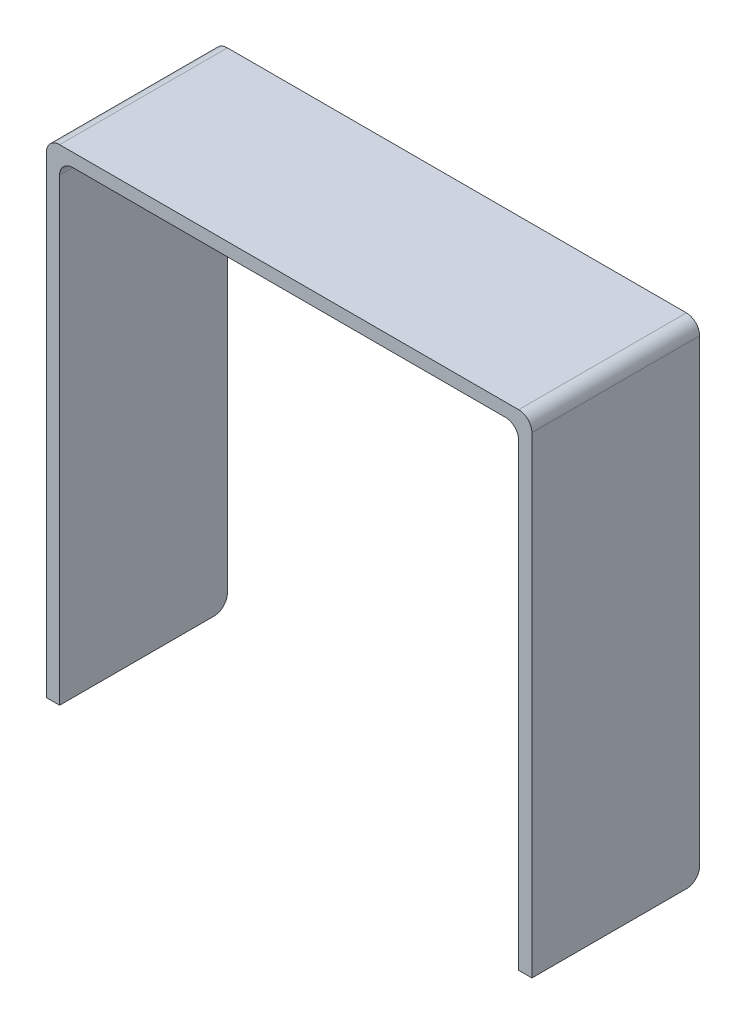
ISO-10303-21;
HEADER;
FILE_DESCRIPTION(('STEP AP214'),'2;1');
FILE_NAME('part.step','',(''),(''),'','','');
FILE_SCHEMA(('AUTOMOTIVE_DESIGN { 1 0 10303 214 1 1 1 1 }'));
ENDSEC;
DATA;
#1=APPLICATION_CONTEXT('core data for automotive mechanical design processes');
#2=APPLICATION_PROTOCOL_DEFINITION('international standard','automotive_design',2000,#1);
#3=PRODUCT_CONTEXT('',#1,'mechanical');
#4=PRODUCT('Part','Part','',(#3));
#5=PRODUCT_RELATED_PRODUCT_CATEGORY('part','',(#4));
#6=PRODUCT_DEFINITION_FORMATION('','',#4);
#7=PRODUCT_DEFINITION_CONTEXT('part definition',#1,'design');
#8=PRODUCT_DEFINITION('design','',#6,#7);
#9=PRODUCT_DEFINITION_SHAPE('','',#8);
#10=(LENGTH_UNIT() NAMED_UNIT(*) SI_UNIT(.MILLI.,.METRE.));
#11=(NAMED_UNIT(*) PLANE_ANGLE_UNIT() SI_UNIT($,.RADIAN.));
#12=(NAMED_UNIT(*) SI_UNIT($,.STERADIAN.) SOLID_ANGLE_UNIT());
#13=UNCERTAINTY_MEASURE_WITH_UNIT(LENGTH_MEASURE(1.E-05),#10,'distance_accuracy_value','');
#14=(GEOMETRIC_REPRESENTATION_CONTEXT(3) GLOBAL_UNCERTAINTY_ASSIGNED_CONTEXT((#13)) GLOBAL_UNIT_ASSIGNED_CONTEXT((#10,
#11,#12)) REPRESENTATION_CONTEXT('',''));
#15=CARTESIAN_POINT('',(0.,0.,0.));
#16=DIRECTION('',(0.,0.,1.));
#17=DIRECTION('',(1.,0.,0.));
#18=AXIS2_PLACEMENT_3D('',#15,#16,#17);
#19=CARTESIAN_POINT('',(0.,0.,0.));
#20=DIRECTION('',(0.,-1.,0.));
#21=DIRECTION('',(0.,0.,-1.));
#22=AXIS2_PLACEMENT_3D('',#19,#20,#21);
#23=PLANE('',#22);
#24=DIRECTION('',(-1.,0.,0.));
#25=VECTOR('',#24,1.);
#26=CARTESIAN_POINT('',(55.,0.,19.));
#27=LINE('',#26,#25);
#28=CARTESIAN_POINT('',(49.,0.,19.));
#29=VERTEX_POINT('',#28);
#30=CARTESIAN_POINT('',(-49.,0.,19.));
#31=VERTEX_POINT('',#30);
#32=EDGE_CURVE('E248',#29,#31,#27,.T.);
#33=ORIENTED_EDGE('',*,*,#32,.T.);
#34=DIRECTION('',(0.,0.,1.));
#35=VECTOR('',#34,1.);
#36=CARTESIAN_POINT('',(-49.,0.,0.));
#37=LINE('',#36,#35);
#38=CARTESIAN_POINT('',(-49.,0.,-19.));
#39=VERTEX_POINT('',#38);
#40=EDGE_CURVE('E308',#31,#39,#37,.F.);
#41=ORIENTED_EDGE('',*,*,#40,.T.);
#42=DIRECTION('',(-1.,0.,0.));
#43=VECTOR('',#42,1.);
#44=CARTESIAN_POINT('',(55.,0.,-19.));
#45=LINE('',#44,#43);
#46=CARTESIAN_POINT('',(49.,0.,-19.));
#47=VERTEX_POINT('',#46);
#48=EDGE_CURVE('E243',#47,#39,#45,.T.);
#49=ORIENTED_EDGE('',*,*,#48,.F.);
#50=DIRECTION('',(0.,0.,-1.));
#51=VECTOR('',#50,1.);
#52=CARTESIAN_POINT('',(49.,0.,0.));
#53=LINE('',#52,#51);
#54=EDGE_CURVE('E297',#47,#29,#53,.F.);
#55=ORIENTED_EDGE('',*,*,#54,.T.);
#56=EDGE_LOOP('',(#33,#41,#49,#55));
#57=FACE_BOUND('',#56,.T.);
#58=ADVANCED_FACE('F86',(#57),#23,.T.);
#59=CARTESIAN_POINT('',(55.,3.,19.));
#60=DIRECTION('',(0.,0.,1.));
#61=DIRECTION('',(1.,0.,0.));
#62=AXIS2_PLACEMENT_3D('',#59,#60,#61);
#63=PLANE('',#62);
#64=DIRECTION('',(-1.,0.,0.));
#65=VECTOR('',#64,1.);
#66=CARTESIAN_POINT('',(55.,3.,19.));
#67=LINE('',#66,#65);
#68=CARTESIAN_POINT('',(52.,3.,19.));
#69=VERTEX_POINT('',#68);
#70=CARTESIAN_POINT('',(-52.,3.,19.));
#71=VERTEX_POINT('',#70);
#72=EDGE_CURVE('E239',#69,#71,#67,.T.);
#73=ORIENTED_EDGE('',*,*,#72,.T.);
#74=CARTESIAN_POINT('',(-52.,0.,19.));
#75=DIRECTION('',(0.,0.,1.));
#76=DIRECTION('',(1.,0.,0.));
#77=AXIS2_PLACEMENT_3D('',#74,#75,#76);
#78=CIRCLE('',#77,3.);
#79=CARTESIAN_POINT('',(-55.,0.,19.));
#80=VERTEX_POINT('',#79);
#81=EDGE_CURVE('E277',#71,#80,#78,.T.);
#82=ORIENTED_EDGE('',*,*,#81,.T.);
#83=DIRECTION('',(0.,-1.,0.));
#84=VECTOR('',#83,1.);
#85=CARTESIAN_POINT('',(-55.,3.,19.));
#86=LINE('',#85,#84);
#87=CARTESIAN_POINT('',(-55.,-107.,19.));
#88=VERTEX_POINT('',#87);
#89=EDGE_CURVE('E215',#80,#88,#86,.T.);
#90=ORIENTED_EDGE('',*,*,#89,.T.);
#91=DIRECTION('',(-1.,0.,0.));
#92=VECTOR('',#91,1.);
#93=CARTESIAN_POINT('',(-55.,-107.,19.));
#94=LINE('',#93,#92);
#95=CARTESIAN_POINT('',(-52.,-107.,19.));
#96=VERTEX_POINT('',#95);
#97=EDGE_CURVE('E194',#96,#88,#94,.T.);
#98=ORIENTED_EDGE('',*,*,#97,.F.);
#99=DIRECTION('',(0.,1.,0.));
#100=VECTOR('',#99,1.);
#101=CARTESIAN_POINT('',(-52.,-107.,19.));
#102=LINE('',#101,#100);
#103=CARTESIAN_POINT('',(-52.,-3.,19.));
#104=VERTEX_POINT('',#103);
#105=EDGE_CURVE('E204',#96,#104,#102,.T.);
#106=ORIENTED_EDGE('',*,*,#105,.T.);
#107=CARTESIAN_POINT('',(-49.,-3.,19.));
#108=DIRECTION('',(0.,0.,1.));
#109=DIRECTION('',(1.,0.,0.));
#110=AXIS2_PLACEMENT_3D('',#107,#108,#109);
#111=CIRCLE('',#110,3.);
#112=EDGE_CURVE('E311',#104,#31,#111,.F.);
#113=ORIENTED_EDGE('',*,*,#112,.T.);
#114=ORIENTED_EDGE('',*,*,#32,.F.);
#115=CARTESIAN_POINT('',(49.,-3.,19.));
#116=DIRECTION('',(0.,0.,1.));
#117=DIRECTION('',(1.,0.,0.));
#118=AXIS2_PLACEMENT_3D('',#115,#116,#117);
#119=CIRCLE('',#118,3.);
#120=CARTESIAN_POINT('',(52.,-3.,19.));
#121=VERTEX_POINT('',#120);
#122=EDGE_CURVE('E303',#29,#121,#119,.F.);
#123=ORIENTED_EDGE('',*,*,#122,.T.);
#124=DIRECTION('',(0.,1.,0.));
#125=VECTOR('',#124,1.);
#126=CARTESIAN_POINT('',(52.,-107.,19.));
#127=LINE('',#126,#125);
#128=CARTESIAN_POINT('',(52.,-107.,19.));
#129=VERTEX_POINT('',#128);
#130=EDGE_CURVE('E234',#129,#121,#127,.T.);
#131=ORIENTED_EDGE('',*,*,#130,.F.);
#132=DIRECTION('',(-1.,0.,0.));
#133=VECTOR('',#132,1.);
#134=CARTESIAN_POINT('',(55.,-107.,19.));
#135=LINE('',#134,#133);
#136=CARTESIAN_POINT('',(55.,-107.,19.));
#137=VERTEX_POINT('',#136);
#138=EDGE_CURVE('E225',#137,#129,#135,.T.);
#139=ORIENTED_EDGE('',*,*,#138,.F.);
#140=DIRECTION('',(0.,-1.,0.));
#141=VECTOR('',#140,1.);
#142=CARTESIAN_POINT('',(55.,3.,19.));
#143=LINE('',#142,#141);
#144=CARTESIAN_POINT('',(55.,0.,19.));
#145=VERTEX_POINT('',#144);
#146=EDGE_CURVE('E247',#145,#137,#143,.T.);
#147=ORIENTED_EDGE('',*,*,#146,.F.);
#148=CARTESIAN_POINT('',(52.,0.,19.));
#149=DIRECTION('',(0.,0.,1.));
#150=DIRECTION('',(1.,0.,0.));
#151=AXIS2_PLACEMENT_3D('',#148,#149,#150);
#152=CIRCLE('',#151,3.);
#153=EDGE_CURVE('E274',#145,#69,#152,.T.);
#154=ORIENTED_EDGE('',*,*,#153,.T.);
#155=EDGE_LOOP('',(#73,#82,#90,#98,#106,#113,#114,#123,#131,#139,#147,#154));
#156=FACE_BOUND('',#155,.T.);
#157=ADVANCED_FACE('F213',(#156),#63,.T.);
#158=CARTESIAN_POINT('',(55.,3.,-19.));
#159=DIRECTION('',(0.,0.,1.));
#160=DIRECTION('',(1.,0.,0.));
#161=AXIS2_PLACEMENT_3D('',#158,#159,#160);
#162=PLANE('',#161);
#163=DIRECTION('',(0.,1.,0.));
#164=VECTOR('',#163,1.);
#165=CARTESIAN_POINT('',(-52.,-107.,-19.));
#166=LINE('',#165,#164);
#167=CARTESIAN_POINT('',(-52.,-104.,-19.));
#168=VERTEX_POINT('',#167);
#169=CARTESIAN_POINT('',(-52.,-3.,-19.));
#170=VERTEX_POINT('',#169);
#171=EDGE_CURVE('E210',#168,#170,#166,.T.);
#172=ORIENTED_EDGE('',*,*,#171,.F.);
#173=DIRECTION('',(1.,0.,0.));
#174=VECTOR('',#173,1.);
#175=CARTESIAN_POINT('',(55.,-104.,-19.));
#176=LINE('',#175,#174);
#177=CARTESIAN_POINT('',(-55.,-104.,-19.));
#178=VERTEX_POINT('',#177);
#179=EDGE_CURVE('E326',#168,#178,#176,.F.);
#180=ORIENTED_EDGE('',*,*,#179,.T.);
#181=DIRECTION('',(0.,-1.,0.));
#182=VECTOR('',#181,1.);
#183=CARTESIAN_POINT('',(-55.,3.,-19.));
#184=LINE('',#183,#182);
#185=CARTESIAN_POINT('',(-55.,0.,-19.));
#186=VERTEX_POINT('',#185);
#187=EDGE_CURVE('E238',#186,#178,#184,.T.);
#188=ORIENTED_EDGE('',*,*,#187,.F.);
#189=CARTESIAN_POINT('',(-52.,0.,-19.));
#190=DIRECTION('',(0.,0.,1.));
#191=DIRECTION('',(1.,0.,0.));
#192=AXIS2_PLACEMENT_3D('',#189,#190,#191);
#193=CIRCLE('',#192,3.);
#194=CARTESIAN_POINT('',(-52.,3.,-19.));
#195=VERTEX_POINT('',#194);
#196=EDGE_CURVE('E286',#186,#195,#193,.F.);
#197=ORIENTED_EDGE('',*,*,#196,.T.);
#198=DIRECTION('',(-1.,0.,0.));
#199=VECTOR('',#198,1.);
#200=CARTESIAN_POINT('',(55.,3.,-19.));
#201=LINE('',#200,#199);
#202=CARTESIAN_POINT('',(52.,3.,-19.));
#203=VERTEX_POINT('',#202);
#204=EDGE_CURVE('E242',#203,#195,#201,.T.);
#205=ORIENTED_EDGE('',*,*,#204,.F.);
#206=CARTESIAN_POINT('',(52.,0.,-19.));
#207=DIRECTION('',(0.,0.,1.));
#208=DIRECTION('',(1.,0.,0.));
#209=AXIS2_PLACEMENT_3D('',#206,#207,#208);
#210=CIRCLE('',#209,3.);
#211=CARTESIAN_POINT('',(55.,0.,-19.));
#212=VERTEX_POINT('',#211);
#213=EDGE_CURVE('E283',#203,#212,#210,.F.);
#214=ORIENTED_EDGE('',*,*,#213,.T.);
#215=DIRECTION('',(0.,-1.,0.));
#216=VECTOR('',#215,1.);
#217=CARTESIAN_POINT('',(55.,3.,-19.));
#218=LINE('',#217,#216);
#219=CARTESIAN_POINT('',(55.,-104.,-19.));
#220=VERTEX_POINT('',#219);
#221=EDGE_CURVE('E255',#212,#220,#218,.T.);
#222=ORIENTED_EDGE('',*,*,#221,.T.);
#223=DIRECTION('',(1.,0.,0.));
#224=VECTOR('',#223,1.);
#225=CARTESIAN_POINT('',(52.,-104.,-19.));
#226=LINE('',#225,#224);
#227=CARTESIAN_POINT('',(52.,-104.,-19.));
#228=VERTEX_POINT('',#227);
#229=EDGE_CURVE('E323',#220,#228,#226,.F.);
#230=ORIENTED_EDGE('',*,*,#229,.T.);
#231=DIRECTION('',(0.,1.,0.));
#232=VECTOR('',#231,1.);
#233=CARTESIAN_POINT('',(52.,-107.,-19.));
#234=LINE('',#233,#232);
#235=CARTESIAN_POINT('',(52.,-3.,-19.));
#236=VERTEX_POINT('',#235);
#237=EDGE_CURVE('E231',#228,#236,#234,.T.);
#238=ORIENTED_EDGE('',*,*,#237,.T.);
#239=CARTESIAN_POINT('',(49.,-3.,-19.));
#240=DIRECTION('',(0.,0.,1.));
#241=DIRECTION('',(1.,0.,0.));
#242=AXIS2_PLACEMENT_3D('',#239,#240,#241);
#243=CIRCLE('',#242,3.);
#244=EDGE_CURVE('E300',#236,#47,#243,.T.);
#245=ORIENTED_EDGE('',*,*,#244,.T.);
#246=ORIENTED_EDGE('',*,*,#48,.T.);
#247=CARTESIAN_POINT('',(-49.,-3.,-19.));
#248=DIRECTION('',(0.,0.,1.));
#249=DIRECTION('',(1.,0.,0.));
#250=AXIS2_PLACEMENT_3D('',#247,#248,#249);
#251=CIRCLE('',#250,3.);
#252=EDGE_CURVE('E314',#39,#170,#251,.T.);
#253=ORIENTED_EDGE('',*,*,#252,.T.);
#254=EDGE_LOOP('',(#172,#180,#188,#197,#205,#214,#222,#230,#238,#245,#246,#253));
#255=FACE_BOUND('',#254,.T.);
#256=ADVANCED_FACE('F342',(#255),#162,.F.);
#257=CARTESIAN_POINT('',(55.,3.,-19.));
#258=DIRECTION('',(1.,0.,0.));
#259=DIRECTION('',(0.,0.,-1.));
#260=AXIS2_PLACEMENT_3D('',#257,#258,#259);
#261=PLANE('',#260);
#262=DIRECTION('',(0.,0.,1.));
#263=VECTOR('',#262,1.);
#264=CARTESIAN_POINT('',(55.,-107.,-19.));
#265=LINE('',#264,#263);
#266=CARTESIAN_POINT('',(55.,-107.,-16.));
#267=VERTEX_POINT('',#266);
#268=EDGE_CURVE('E222',#267,#137,#265,.T.);
#269=ORIENTED_EDGE('',*,*,#268,.F.);
#270=CARTESIAN_POINT('',(55.,-104.,-16.));
#271=DIRECTION('',(1.,0.,0.));
#272=DIRECTION('',(0.,0.,-1.));
#273=AXIS2_PLACEMENT_3D('',#270,#271,#272);
#274=CIRCLE('',#273,3.);
#275=EDGE_CURVE('E95',#267,#220,#274,.T.);
#276=ORIENTED_EDGE('',*,*,#275,.T.);
#277=ORIENTED_EDGE('',*,*,#221,.F.);
#278=DIRECTION('',(0.,0.,1.));
#279=VECTOR('',#278,1.);
#280=CARTESIAN_POINT('',(55.,0.,19.));
#281=LINE('',#280,#279);
#282=EDGE_CURVE('E289',#212,#145,#281,.T.);
#283=ORIENTED_EDGE('',*,*,#282,.T.);
#284=ORIENTED_EDGE('',*,*,#146,.T.);
#285=EDGE_LOOP('',(#269,#276,#277,#283,#284));
#286=FACE_BOUND('',#285,.T.);
#287=ADVANCED_FACE('F338',(#286),#261,.T.);
#288=CARTESIAN_POINT('',(0.,3.,0.));
#289=DIRECTION('',(0.,-1.,0.));
#290=DIRECTION('',(0.,0.,-1.));
#291=AXIS2_PLACEMENT_3D('',#288,#289,#290);
#292=PLANE('',#291);
#293=ORIENTED_EDGE('',*,*,#204,.T.);
#294=DIRECTION('',(0.,0.,1.));
#295=VECTOR('',#294,1.);
#296=CARTESIAN_POINT('',(-52.,3.,0.));
#297=LINE('',#296,#295);
#298=EDGE_CURVE('E270',#195,#71,#297,.T.);
#299=ORIENTED_EDGE('',*,*,#298,.T.);
#300=ORIENTED_EDGE('',*,*,#72,.F.);
#301=DIRECTION('',(0.,0.,1.));
#302=VECTOR('',#301,1.);
#303=CARTESIAN_POINT('',(52.,3.,-19.));
#304=LINE('',#303,#302);
#305=EDGE_CURVE('E259',#69,#203,#304,.F.);
#306=ORIENTED_EDGE('',*,*,#305,.T.);
#307=EDGE_LOOP('',(#293,#299,#300,#306));
#308=FACE_BOUND('',#307,.T.);
#309=ADVANCED_FACE('F378',(#308),#292,.F.);
#310=CARTESIAN_POINT('',(-55.,3.,-19.));
#311=DIRECTION('',(1.,0.,0.));
#312=DIRECTION('',(0.,0.,-1.));
#313=AXIS2_PLACEMENT_3D('',#310,#311,#312);
#314=PLANE('',#313);
#315=ORIENTED_EDGE('',*,*,#187,.T.);
#316=CARTESIAN_POINT('',(-55.,-104.,-16.));
#317=DIRECTION('',(1.,0.,0.));
#318=DIRECTION('',(0.,0.,-1.));
#319=AXIS2_PLACEMENT_3D('',#316,#317,#318);
#320=CIRCLE('',#319,3.);
#321=CARTESIAN_POINT('',(-55.,-107.,-16.));
#322=VERTEX_POINT('',#321);
#323=EDGE_CURVE('E329',#178,#322,#320,.F.);
#324=ORIENTED_EDGE('',*,*,#323,.T.);
#325=DIRECTION('',(0.,0.,-1.));
#326=VECTOR('',#325,1.);
#327=CARTESIAN_POINT('',(-55.,-107.,-19.));
#328=LINE('',#327,#326);
#329=EDGE_CURVE('E200',#88,#322,#328,.T.);
#330=ORIENTED_EDGE('',*,*,#329,.F.);
#331=ORIENTED_EDGE('',*,*,#89,.F.);
#332=DIRECTION('',(0.,0.,1.));
#333=VECTOR('',#332,1.);
#334=CARTESIAN_POINT('',(-55.,0.,-19.));
#335=LINE('',#334,#333);
#336=EDGE_CURVE('E280',#80,#186,#335,.F.);
#337=ORIENTED_EDGE('',*,*,#336,.T.);
#338=EDGE_LOOP('',(#315,#324,#330,#331,#337));
#339=FACE_BOUND('',#338,.T.);
#340=ADVANCED_FACE('F369',(#339),#314,.F.);
#341=CARTESIAN_POINT('',(52.,-107.,-19.));
#342=DIRECTION('',(1.,0.,0.));
#343=DIRECTION('',(0.,0.,-1.));
#344=AXIS2_PLACEMENT_3D('',#341,#342,#343);
#345=PLANE('',#344);
#346=ORIENTED_EDGE('',*,*,#237,.F.);
#347=CARTESIAN_POINT('',(52.,-104.,-16.));
#348=DIRECTION('',(1.,0.,0.));
#349=DIRECTION('',(0.,0.,-1.));
#350=AXIS2_PLACEMENT_3D('',#347,#348,#349);
#351=CIRCLE('',#350,3.);
#352=CARTESIAN_POINT('',(52.,-107.,-16.));
#353=VERTEX_POINT('',#352);
#354=EDGE_CURVE('E12',#228,#353,#351,.F.);
#355=ORIENTED_EDGE('',*,*,#354,.T.);
#356=DIRECTION('',(0.,0.,-1.));
#357=VECTOR('',#356,1.);
#358=CARTESIAN_POINT('',(52.,-107.,-19.));
#359=LINE('',#358,#357);
#360=EDGE_CURVE('E228',#129,#353,#359,.T.);
#361=ORIENTED_EDGE('',*,*,#360,.F.);
#362=ORIENTED_EDGE('',*,*,#130,.T.);
#363=DIRECTION('',(0.,0.,-1.));
#364=VECTOR('',#363,1.);
#365=CARTESIAN_POINT('',(52.,-3.,-19.));
#366=LINE('',#365,#364);
#367=EDGE_CURVE('E293',#121,#236,#366,.T.);
#368=ORIENTED_EDGE('',*,*,#367,.T.);
#369=EDGE_LOOP('',(#346,#355,#361,#362,#368));
#370=FACE_BOUND('',#369,.T.);
#371=ADVANCED_FACE('F349',(#370),#345,.F.);
#372=CARTESIAN_POINT('',(0.,-107.,0.));
#373=DIRECTION('',(0.,-1.,0.));
#374=DIRECTION('',(0.,0.,-1.));
#375=AXIS2_PLACEMENT_3D('',#372,#373,#374);
#376=PLANE('',#375);
#377=ORIENTED_EDGE('',*,*,#360,.T.);
#378=DIRECTION('',(1.,0.,0.));
#379=VECTOR('',#378,1.);
#380=CARTESIAN_POINT('',(55.,-107.,-16.));
#381=LINE('',#380,#379);
#382=EDGE_CURVE('E332',#353,#267,#381,.T.);
#383=ORIENTED_EDGE('',*,*,#382,.T.);
#384=ORIENTED_EDGE('',*,*,#268,.T.);
#385=ORIENTED_EDGE('',*,*,#138,.T.);
#386=EDGE_LOOP('',(#377,#383,#384,#385));
#387=FACE_BOUND('',#386,.T.);
#388=ADVANCED_FACE('F346',(#387),#376,.T.);
#389=CARTESIAN_POINT('',(-52.,-107.,-19.));
#390=DIRECTION('',(-1.,0.,0.));
#391=DIRECTION('',(0.,0.,1.));
#392=AXIS2_PLACEMENT_3D('',#389,#390,#391);
#393=PLANE('',#392);
#394=DIRECTION('',(0.,0.,1.));
#395=VECTOR('',#394,1.);
#396=CARTESIAN_POINT('',(-52.,-107.,-19.));
#397=LINE('',#396,#395);
#398=CARTESIAN_POINT('',(-52.,-107.,-16.));
#399=VERTEX_POINT('',#398);
#400=EDGE_CURVE('E189',#399,#96,#397,.T.);
#401=ORIENTED_EDGE('',*,*,#400,.F.);
#402=CARTESIAN_POINT('',(-52.,-104.,-16.));
#403=DIRECTION('',(-1.,0.,0.));
#404=DIRECTION('',(0.,0.,1.));
#405=AXIS2_PLACEMENT_3D('',#402,#403,#404);
#406=CIRCLE('',#405,3.);
#407=EDGE_CURVE('E320',#399,#168,#406,.F.);
#408=ORIENTED_EDGE('',*,*,#407,.T.);
#409=ORIENTED_EDGE('',*,*,#171,.T.);
#410=DIRECTION('',(0.,0.,1.));
#411=VECTOR('',#410,1.);
#412=CARTESIAN_POINT('',(-52.,-3.,-19.));
#413=LINE('',#412,#411);
#414=EDGE_CURVE('E207',#170,#104,#413,.T.);
#415=ORIENTED_EDGE('',*,*,#414,.T.);
#416=ORIENTED_EDGE('',*,*,#105,.F.);
#417=EDGE_LOOP('',(#401,#408,#409,#415,#416));
#418=FACE_BOUND('',#417,.T.);
#419=ADVANCED_FACE('F205',(#418),#393,.F.);
#420=CARTESIAN_POINT('',(0.,-107.,0.));
#421=DIRECTION('',(0.,1.,0.));
#422=DIRECTION('',(0.,0.,1.));
#423=AXIS2_PLACEMENT_3D('',#420,#421,#422);
#424=PLANE('',#423);
#425=ORIENTED_EDGE('',*,*,#329,.T.);
#426=DIRECTION('',(1.,0.,0.));
#427=VECTOR('',#426,1.);
#428=CARTESIAN_POINT('',(0.,-107.,-16.));
#429=LINE('',#428,#427);
#430=EDGE_CURVE('E197',#322,#399,#429,.T.);
#431=ORIENTED_EDGE('',*,*,#430,.T.);
#432=ORIENTED_EDGE('',*,*,#400,.T.);
#433=ORIENTED_EDGE('',*,*,#97,.T.);
#434=EDGE_LOOP('',(#425,#431,#432,#433));
#435=FACE_BOUND('',#434,.T.);
#436=ADVANCED_FACE('F192',(#435),#424,.F.);
#437=CARTESIAN_POINT('',(-52.,0.,0.));
#438=DIRECTION('',(0.,0.,1.));
#439=DIRECTION('',(1.,0.,0.));
#440=AXIS2_PLACEMENT_3D('',#437,#438,#439);
#441=CYLINDRICAL_SURFACE('',#440,3.);
#442=ORIENTED_EDGE('',*,*,#196,.F.);
#443=ORIENTED_EDGE('',*,*,#336,.F.);
#444=ORIENTED_EDGE('',*,*,#81,.F.);
#445=ORIENTED_EDGE('',*,*,#298,.F.);
#446=EDGE_LOOP('',(#442,#443,#444,#445));
#447=FACE_BOUND('',#446,.T.);
#448=ADVANCED_FACE('F375',(#447),#441,.T.);
#449=CARTESIAN_POINT('',(52.,0.,-19.));
#450=DIRECTION('',(0.,0.,-1.));
#451=DIRECTION('',(-1.,0.,0.));
#452=AXIS2_PLACEMENT_3D('',#449,#450,#451);
#453=CYLINDRICAL_SURFACE('',#452,3.);
#454=ORIENTED_EDGE('',*,*,#213,.F.);
#455=ORIENTED_EDGE('',*,*,#305,.F.);
#456=ORIENTED_EDGE('',*,*,#153,.F.);
#457=ORIENTED_EDGE('',*,*,#282,.F.);
#458=EDGE_LOOP('',(#454,#455,#456,#457));
#459=FACE_BOUND('',#458,.T.);
#460=ADVANCED_FACE('F382',(#459),#453,.T.);
#461=CARTESIAN_POINT('',(49.,-3.,-19.));
#462=DIRECTION('',(0.,0.,-1.));
#463=DIRECTION('',(-1.,0.,0.));
#464=AXIS2_PLACEMENT_3D('',#461,#462,#463);
#465=CYLINDRICAL_SURFACE('',#464,3.);
#466=ORIENTED_EDGE('',*,*,#122,.F.);
#467=ORIENTED_EDGE('',*,*,#54,.F.);
#468=ORIENTED_EDGE('',*,*,#244,.F.);
#469=ORIENTED_EDGE('',*,*,#367,.F.);
#470=EDGE_LOOP('',(#466,#467,#468,#469));
#471=FACE_BOUND('',#470,.T.);
#472=ADVANCED_FACE('F354',(#471),#465,.F.);
#473=CARTESIAN_POINT('',(-49.,-3.,-19.));
#474=DIRECTION('',(0.,0.,1.));
#475=DIRECTION('',(1.,0.,0.));
#476=AXIS2_PLACEMENT_3D('',#473,#474,#475);
#477=CYLINDRICAL_SURFACE('',#476,3.);
#478=ORIENTED_EDGE('',*,*,#252,.F.);
#479=ORIENTED_EDGE('',*,*,#40,.F.);
#480=ORIENTED_EDGE('',*,*,#112,.F.);
#481=ORIENTED_EDGE('',*,*,#414,.F.);
#482=EDGE_LOOP('',(#478,#479,#480,#481));
#483=FACE_BOUND('',#482,.T.);
#484=ADVANCED_FACE('F362',(#483),#477,.F.);
#485=CARTESIAN_POINT('',(0.,-104.,-16.));
#486=DIRECTION('',(1.,0.,0.));
#487=DIRECTION('',(0.,0.,-1.));
#488=AXIS2_PLACEMENT_3D('',#485,#486,#487);
#489=CYLINDRICAL_SURFACE('',#488,3.);
#490=ORIENTED_EDGE('',*,*,#323,.F.);
#491=ORIENTED_EDGE('',*,*,#179,.F.);
#492=ORIENTED_EDGE('',*,*,#407,.F.);
#493=ORIENTED_EDGE('',*,*,#430,.F.);
#494=EDGE_LOOP('',(#490,#491,#492,#493));
#495=FACE_BOUND('',#494,.T.);
#496=ADVANCED_FACE('F367',(#495),#489,.T.);
#497=CARTESIAN_POINT('',(0.,-104.,-16.));
#498=DIRECTION('',(-1.,0.,0.));
#499=DIRECTION('',(0.,0.,1.));
#500=AXIS2_PLACEMENT_3D('',#497,#498,#499);
#501=CYLINDRICAL_SURFACE('',#500,3.);
#502=ORIENTED_EDGE('',*,*,#354,.F.);
#503=ORIENTED_EDGE('',*,*,#229,.F.);
#504=ORIENTED_EDGE('',*,*,#275,.F.);
#505=ORIENTED_EDGE('',*,*,#382,.F.);
#506=EDGE_LOOP('',(#502,#503,#504,#505));
#507=FACE_BOUND('',#506,.T.);
#508=ADVANCED_FACE('F88',(#507),#501,.T.);
#509=CLOSED_SHELL('',(#58,#157,#256,#287,#309,#340,#371,#388,#419,#436,#448,#460,#472,#484,#496,#508));
#510=MANIFOLD_SOLID_BREP('B2',#509);
#511=ADVANCED_BREP_SHAPE_REPRESENTATION('',(#18,#510),#14);
#512=SHAPE_DEFINITION_REPRESENTATION(#9,#511);
ENDSEC;
END-ISO-10303-21;
